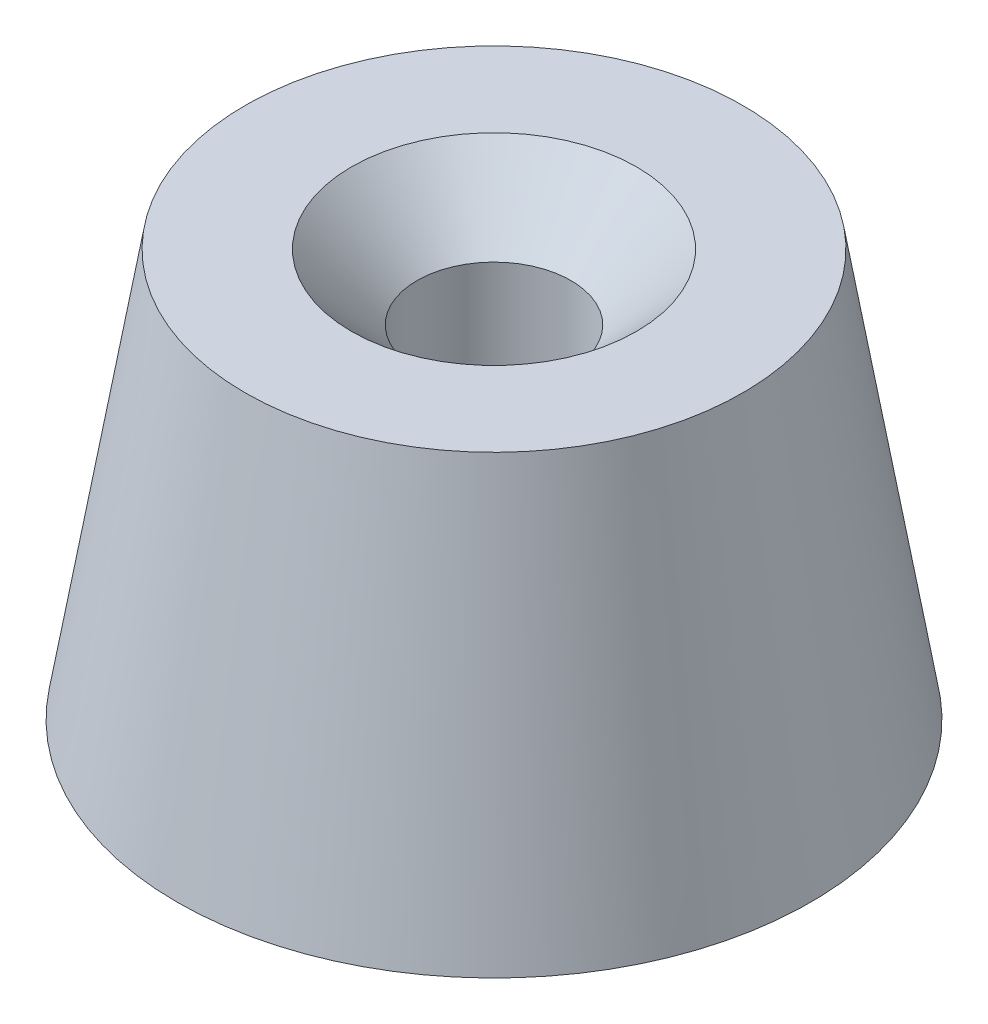
ISO-10303-21;
HEADER;
FILE_DESCRIPTION(('STEP AP214'),'2;1');
FILE_NAME('part.step','',(''),(''),'','','');
FILE_SCHEMA(('AUTOMOTIVE_DESIGN { 1 0 10303 214 1 1 1 1 }'));
ENDSEC;
DATA;
#1=APPLICATION_CONTEXT('core data for automotive mechanical design processes');
#2=APPLICATION_PROTOCOL_DEFINITION('international standard','automotive_design',2000,#1);
#3=PRODUCT_CONTEXT('',#1,'mechanical');
#4=PRODUCT('Part','Part','',(#3));
#5=PRODUCT_RELATED_PRODUCT_CATEGORY('part','',(#4));
#6=PRODUCT_DEFINITION_FORMATION('','',#4);
#7=PRODUCT_DEFINITION_CONTEXT('part definition',#1,'design');
#8=PRODUCT_DEFINITION('design','',#6,#7);
#9=PRODUCT_DEFINITION_SHAPE('','',#8);
#10=(LENGTH_UNIT() NAMED_UNIT(*) SI_UNIT(.MILLI.,.METRE.));
#11=(NAMED_UNIT(*) PLANE_ANGLE_UNIT() SI_UNIT($,.RADIAN.));
#12=(NAMED_UNIT(*) SI_UNIT($,.STERADIAN.) SOLID_ANGLE_UNIT());
#13=UNCERTAINTY_MEASURE_WITH_UNIT(LENGTH_MEASURE(1.E-05),#10,'distance_accuracy_value','');
#14=(GEOMETRIC_REPRESENTATION_CONTEXT(3) GLOBAL_UNCERTAINTY_ASSIGNED_CONTEXT((#13)) GLOBAL_UNIT_ASSIGNED_CONTEXT((#10,
#11,#12)) REPRESENTATION_CONTEXT('',''));
#15=CARTESIAN_POINT('',(0.,0.,0.));
#16=DIRECTION('',(0.,0.,1.));
#17=DIRECTION('',(1.,0.,0.));
#18=AXIS2_PLACEMENT_3D('',#15,#16,#17);
#19=CARTESIAN_POINT('',(0.,0.,0.));
#20=DIRECTION('',(0.,1.,0.));
#21=DIRECTION('',(0.,0.,1.));
#22=AXIS2_PLACEMENT_3D('',#19,#20,#21);
#23=PLANE('',#22);
#24=CARTESIAN_POINT('',(0.,0.,0.));
#25=DIRECTION('',(0.,1.,0.));
#26=DIRECTION('',(0.,0.,1.));
#27=AXIS2_PLACEMENT_3D('',#24,#25,#26);
#28=CIRCLE('',#27,1.7);
#29=CARTESIAN_POINT('',(0.,0.,1.7));
#30=VERTEX_POINT('',#29);
#31=EDGE_CURVE('E37',#30,#30,#28,.T.);
#32=ORIENTED_EDGE('',*,*,#31,.T.);
#33=EDGE_LOOP('',(#32));
#34=FACE_BOUND('',#33,.T.);
#35=CARTESIAN_POINT('',(0.,0.,0.));
#36=DIRECTION('',(0.,1.,0.));
#37=DIRECTION('',(0.,0.,1.));
#38=AXIS2_PLACEMENT_3D('',#35,#36,#37);
#39=CIRCLE('',#38,7.);
#40=CARTESIAN_POINT('',(0.,0.,7.));
#41=VERTEX_POINT('',#40);
#42=EDGE_CURVE('E11',#41,#41,#39,.T.);
#43=ORIENTED_EDGE('',*,*,#42,.F.);
#44=EDGE_LOOP('',(#43));
#45=FACE_BOUND('',#44,.T.);
#46=ADVANCED_FACE('F33',(#34,#45),#23,.F.);
#47=CARTESIAN_POINT('',(0.,9.,0.));
#48=DIRECTION('',(0.,1.,0.));
#49=DIRECTION('',(0.,0.,1.));
#50=AXIS2_PLACEMENT_3D('',#47,#48,#49);
#51=PLANE('',#50);
#52=CARTESIAN_POINT('',(0.,9.,0.));
#53=DIRECTION('',(0.,1.,0.));
#54=DIRECTION('',(0.,0.,1.));
#55=AXIS2_PLACEMENT_3D('',#52,#53,#54);
#56=CIRCLE('',#55,3.15);
#57=CARTESIAN_POINT('',(0.,9.,3.15));
#58=VERTEX_POINT('',#57);
#59=EDGE_CURVE('E105',#58,#58,#56,.T.);
#60=ORIENTED_EDGE('',*,*,#59,.F.);
#61=EDGE_LOOP('',(#60));
#62=FACE_BOUND('',#61,.T.);
#63=CARTESIAN_POINT('',(0.,9.,0.));
#64=DIRECTION('',(0.,1.,0.));
#65=DIRECTION('',(0.,0.,1.));
#66=AXIS2_PLACEMENT_3D('',#63,#64,#65);
#67=CIRCLE('',#66,5.5);
#68=CARTESIAN_POINT('',(0.,9.,5.5));
#69=VERTEX_POINT('',#68);
#70=EDGE_CURVE('E41',#69,#69,#67,.T.);
#71=ORIENTED_EDGE('',*,*,#70,.T.);
#72=EDGE_LOOP('',(#71));
#73=FACE_BOUND('',#72,.T.);
#74=ADVANCED_FACE('F67',(#62,#73),#51,.T.);
#75=CARTESIAN_POINT('',(0.,9.,0.));
#76=DIRECTION('',(0.,-1.,0.));
#77=DIRECTION('',(0.,0.,-1.));
#78=AXIS2_PLACEMENT_3D('',#75,#76,#77);
#79=CONICAL_SURFACE('',#78,5.5,0.165148677414627);
#80=ORIENTED_EDGE('',*,*,#70,.F.);
#81=EDGE_LOOP('',(#80));
#82=FACE_BOUND('',#81,.T.);
#83=ORIENTED_EDGE('',*,*,#42,.T.);
#84=EDGE_LOOP('',(#83));
#85=FACE_BOUND('',#84,.T.);
#86=ADVANCED_FACE('F76',(#82,#85),#79,.T.);
#87=CARTESIAN_POINT('',(0.,9.,0.));
#88=DIRECTION('',(0.,1.,0.));
#89=DIRECTION('',(0.,0.,1.));
#90=AXIS2_PLACEMENT_3D('',#87,#88,#89);
#91=CYLINDRICAL_SURFACE('',#90,1.7);
#92=CARTESIAN_POINT('',(0.,7.55,0.));
#93=DIRECTION('',(0.,1.,0.));
#94=DIRECTION('',(0.,0.,1.));
#95=AXIS2_PLACEMENT_3D('',#92,#93,#94);
#96=CIRCLE('',#95,1.7);
#97=CARTESIAN_POINT('',(0.,7.55,1.7));
#98=VERTEX_POINT('',#97);
#99=EDGE_CURVE('E102',#98,#98,#96,.T.);
#100=ORIENTED_EDGE('',*,*,#99,.T.);
#101=EDGE_LOOP('',(#100));
#102=FACE_BOUND('',#101,.T.);
#103=ORIENTED_EDGE('',*,*,#31,.F.);
#104=EDGE_LOOP('',(#103));
#105=FACE_BOUND('',#104,.T.);
#106=ADVANCED_FACE('F78',(#102,#105),#91,.F.);
#107=CARTESIAN_POINT('',(0.,9.,0.));
#108=DIRECTION('',(0.,1.,0.));
#109=DIRECTION('',(0.,0.,1.));
#110=AXIS2_PLACEMENT_3D('',#107,#108,#109);
#111=CONICAL_SURFACE('',#110,3.15,0.785398163397448);
#112=ORIENTED_EDGE('',*,*,#99,.F.);
#113=EDGE_LOOP('',(#112));
#114=FACE_BOUND('',#113,.T.);
#115=ORIENTED_EDGE('',*,*,#59,.T.);
#116=EDGE_LOOP('',(#115));
#117=FACE_BOUND('',#116,.T.);
#118=ADVANCED_FACE('F109',(#114,#117),#111,.F.);
#119=CLOSED_SHELL('',(#46,#74,#86,#106,#118));
#120=MANIFOLD_SOLID_BREP('B2',#119);
#121=ADVANCED_BREP_SHAPE_REPRESENTATION('',(#18,#120),#14);
#122=SHAPE_DEFINITION_REPRESENTATION(#9,#121);
ENDSEC;
END-ISO-10303-21;
